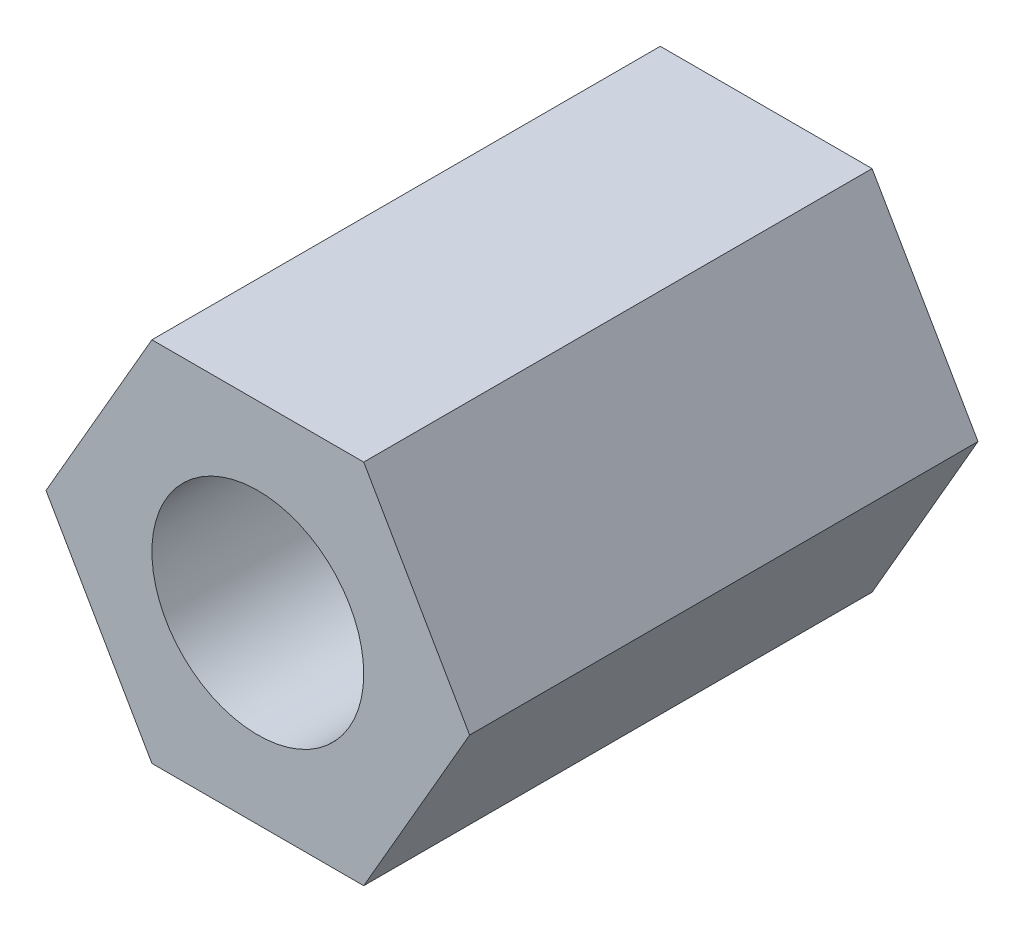
ISO-10303-21;
HEADER;
FILE_DESCRIPTION(('STEP AP214'),'2;1');
FILE_NAME('part.step','',(''),(''),'','','');
FILE_SCHEMA(('AUTOMOTIVE_DESIGN { 1 0 10303 214 1 1 1 1 }'));
ENDSEC;
DATA;
#1=APPLICATION_CONTEXT('core data for automotive mechanical design processes');
#2=APPLICATION_PROTOCOL_DEFINITION('international standard','automotive_design',2000,#1);
#3=PRODUCT_CONTEXT('',#1,'mechanical');
#4=PRODUCT('Part','Part','',(#3));
#5=PRODUCT_RELATED_PRODUCT_CATEGORY('part','',(#4));
#6=PRODUCT_DEFINITION_FORMATION('','',#4);
#7=PRODUCT_DEFINITION_CONTEXT('part definition',#1,'design');
#8=PRODUCT_DEFINITION('design','',#6,#7);
#9=PRODUCT_DEFINITION_SHAPE('','',#8);
#10=(LENGTH_UNIT() NAMED_UNIT(*) SI_UNIT(.MILLI.,.METRE.));
#11=(NAMED_UNIT(*) PLANE_ANGLE_UNIT() SI_UNIT($,.RADIAN.));
#12=(NAMED_UNIT(*) SI_UNIT($,.STERADIAN.) SOLID_ANGLE_UNIT());
#13=UNCERTAINTY_MEASURE_WITH_UNIT(LENGTH_MEASURE(1.E-05),#10,'distance_accuracy_value','');
#14=(GEOMETRIC_REPRESENTATION_CONTEXT(3) GLOBAL_UNCERTAINTY_ASSIGNED_CONTEXT((#13)) GLOBAL_UNIT_ASSIGNED_CONTEXT((#10,
#11,#12)) REPRESENTATION_CONTEXT('',''));
#15=CARTESIAN_POINT('',(0.,0.,0.));
#16=DIRECTION('',(0.,0.,1.));
#17=DIRECTION('',(1.,0.,0.));
#18=AXIS2_PLACEMENT_3D('',#15,#16,#17);
#19=CARTESIAN_POINT('',(-1.25,-2.1650635094611,6.));
#20=DIRECTION('',(0.866025403784439,-0.5,0.));
#21=DIRECTION('',(0.5,0.866025403784439,0.));
#22=AXIS2_PLACEMENT_3D('',#19,#20,#21);
#23=PLANE('',#22);
#24=DIRECTION('',(0.,0.,1.));
#25=VECTOR('',#24,1.);
#26=CARTESIAN_POINT('',(-1.25,-2.1650635094611,6.));
#27=LINE('',#26,#25);
#28=CARTESIAN_POINT('',(-1.25,-2.1650635094611,0.));
#29=VERTEX_POINT('',#28);
#30=CARTESIAN_POINT('',(-1.25,-2.1650635094611,6.));
#31=VERTEX_POINT('',#30);
#32=EDGE_CURVE('E96',#29,#31,#27,.T.);
#33=ORIENTED_EDGE('',*,*,#32,.T.);
#34=DIRECTION('',(0.5,0.866025403784439,0.));
#35=VECTOR('',#34,1.);
#36=CARTESIAN_POINT('',(-1.25,-2.1650635094611,6.));
#37=LINE('',#36,#35);
#38=CARTESIAN_POINT('',(0.,0.,6.));
#39=VERTEX_POINT('',#38);
#40=EDGE_CURVE('E108',#31,#39,#37,.T.);
#41=ORIENTED_EDGE('',*,*,#40,.T.);
#42=DIRECTION('',(0.,0.,-1.));
#43=VECTOR('',#42,1.);
#44=CARTESIAN_POINT('',(0.,0.,6.));
#45=LINE('',#44,#43);
#46=CARTESIAN_POINT('',(0.,0.,0.));
#47=VERTEX_POINT('',#46);
#48=EDGE_CURVE('E66',#39,#47,#45,.T.);
#49=ORIENTED_EDGE('',*,*,#48,.T.);
#50=DIRECTION('',(0.5,0.866025403784439,0.));
#51=VECTOR('',#50,1.);
#52=CARTESIAN_POINT('',(-1.25,-2.1650635094611,0.));
#53=LINE('',#52,#51);
#54=EDGE_CURVE('E107',#29,#47,#53,.T.);
#55=ORIENTED_EDGE('',*,*,#54,.F.);
#56=EDGE_LOOP('',(#33,#41,#49,#55));
#57=FACE_BOUND('',#56,.T.);
#58=ADVANCED_FACE('F17',(#57),#23,.F.);
#59=CARTESIAN_POINT('',(0.,0.,6.));
#60=DIRECTION('',(0.,-1.,0.));
#61=DIRECTION('',(0.,0.,-1.));
#62=AXIS2_PLACEMENT_3D('',#59,#60,#61);
#63=PLANE('',#62);
#64=ORIENTED_EDGE('',*,*,#48,.F.);
#65=DIRECTION('',(-1.,0.,0.));
#66=VECTOR('',#65,1.);
#67=CARTESIAN_POINT('',(0.,0.,6.));
#68=LINE('',#67,#66);
#69=CARTESIAN_POINT('',(2.5,0.,6.));
#70=VERTEX_POINT('',#69);
#71=EDGE_CURVE('E87',#39,#70,#68,.F.);
#72=ORIENTED_EDGE('',*,*,#71,.T.);
#73=DIRECTION('',(0.,0.,1.));
#74=VECTOR('',#73,1.);
#75=CARTESIAN_POINT('',(2.5,0.,6.));
#76=LINE('',#75,#74);
#77=CARTESIAN_POINT('',(2.5,0.,0.));
#78=VERTEX_POINT('',#77);
#79=EDGE_CURVE('E73',#70,#78,#76,.F.);
#80=ORIENTED_EDGE('',*,*,#79,.T.);
#81=DIRECTION('',(-1.,0.,0.));
#82=VECTOR('',#81,1.);
#83=CARTESIAN_POINT('',(0.,0.,0.));
#84=LINE('',#83,#82);
#85=EDGE_CURVE('E109',#47,#78,#84,.F.);
#86=ORIENTED_EDGE('',*,*,#85,.F.);
#87=EDGE_LOOP('',(#64,#72,#80,#86));
#88=FACE_BOUND('',#87,.T.);
#89=ADVANCED_FACE('F93',(#88),#63,.F.);
#90=CARTESIAN_POINT('',(2.5,0.,6.));
#91=DIRECTION('',(-0.866025403784439,-0.5,0.));
#92=DIRECTION('',(0.5,-0.866025403784439,0.));
#93=AXIS2_PLACEMENT_3D('',#90,#91,#92);
#94=PLANE('',#93);
#95=ORIENTED_EDGE('',*,*,#79,.F.);
#96=DIRECTION('',(0.5,-0.866025403784439,0.));
#97=VECTOR('',#96,1.);
#98=CARTESIAN_POINT('',(2.5,0.,6.));
#99=LINE('',#98,#97);
#100=CARTESIAN_POINT('',(3.75,-2.1650635094611,6.));
#101=VERTEX_POINT('',#100);
#102=EDGE_CURVE('E77',#70,#101,#99,.T.);
#103=ORIENTED_EDGE('',*,*,#102,.T.);
#104=DIRECTION('',(0.,0.,1.));
#105=VECTOR('',#104,1.);
#106=CARTESIAN_POINT('',(3.75,-2.1650635094611,6.));
#107=LINE('',#106,#105);
#108=CARTESIAN_POINT('',(3.75,-2.1650635094611,0.));
#109=VERTEX_POINT('',#108);
#110=EDGE_CURVE('E79',#101,#109,#107,.F.);
#111=ORIENTED_EDGE('',*,*,#110,.T.);
#112=DIRECTION('',(0.5,-0.866025403784439,0.));
#113=VECTOR('',#112,1.);
#114=CARTESIAN_POINT('',(2.5,0.,0.));
#115=LINE('',#114,#113);
#116=EDGE_CURVE('E78',#78,#109,#115,.T.);
#117=ORIENTED_EDGE('',*,*,#116,.F.);
#118=EDGE_LOOP('',(#95,#103,#111,#117));
#119=FACE_BOUND('',#118,.T.);
#120=ADVANCED_FACE('F75',(#119),#94,.F.);
#121=CARTESIAN_POINT('',(3.75,-2.1650635094611,6.));
#122=DIRECTION('',(-0.866025403784439,0.5,0.));
#123=DIRECTION('',(-0.5,-0.866025403784439,0.));
#124=AXIS2_PLACEMENT_3D('',#121,#122,#123);
#125=PLANE('',#124);
#126=ORIENTED_EDGE('',*,*,#110,.F.);
#127=DIRECTION('',(-0.5,-0.866025403784439,0.));
#128=VECTOR('',#127,1.);
#129=CARTESIAN_POINT('',(3.75,-2.1650635094611,6.));
#130=LINE('',#129,#128);
#131=CARTESIAN_POINT('',(2.5,-4.33012701892219,6.));
#132=VERTEX_POINT('',#131);
#133=EDGE_CURVE('E91',#101,#132,#130,.T.);
#134=ORIENTED_EDGE('',*,*,#133,.T.);
#135=DIRECTION('',(0.,0.,1.));
#136=VECTOR('',#135,1.);
#137=CARTESIAN_POINT('',(2.5,-4.33012701892219,6.));
#138=LINE('',#137,#136);
#139=CARTESIAN_POINT('',(2.5,-4.33012701892219,0.));
#140=VERTEX_POINT('',#139);
#141=EDGE_CURVE('E101',#132,#140,#138,.F.);
#142=ORIENTED_EDGE('',*,*,#141,.T.);
#143=DIRECTION('',(-0.5,-0.866025403784439,0.));
#144=VECTOR('',#143,1.);
#145=CARTESIAN_POINT('',(3.75,-2.1650635094611,0.));
#146=LINE('',#145,#144);
#147=EDGE_CURVE('E111',#109,#140,#146,.T.);
#148=ORIENTED_EDGE('',*,*,#147,.F.);
#149=EDGE_LOOP('',(#126,#134,#142,#148));
#150=FACE_BOUND('',#149,.T.);
#151=ADVANCED_FACE('F123',(#150),#125,.F.);
#152=CARTESIAN_POINT('',(2.5,-4.33012701892219,6.));
#153=DIRECTION('',(0.,1.,0.));
#154=DIRECTION('',(0.,0.,1.));
#155=AXIS2_PLACEMENT_3D('',#152,#153,#154);
#156=PLANE('',#155);
#157=ORIENTED_EDGE('',*,*,#141,.F.);
#158=DIRECTION('',(-1.,0.,0.));
#159=VECTOR('',#158,1.);
#160=CARTESIAN_POINT('',(0.,-4.33012701892219,6.));
#161=LINE('',#160,#159);
#162=CARTESIAN_POINT('',(0.,-4.33012701892219,6.));
#163=VERTEX_POINT('',#162);
#164=EDGE_CURVE('E120',#132,#163,#161,.T.);
#165=ORIENTED_EDGE('',*,*,#164,.T.);
#166=DIRECTION('',(0.,0.,1.));
#167=VECTOR('',#166,1.);
#168=CARTESIAN_POINT('',(0.,-4.33012701892219,6.));
#169=LINE('',#168,#167);
#170=CARTESIAN_POINT('',(0.,-4.33012701892219,0.));
#171=VERTEX_POINT('',#170);
#172=EDGE_CURVE('E94',#163,#171,#169,.F.);
#173=ORIENTED_EDGE('',*,*,#172,.T.);
#174=DIRECTION('',(-1.,0.,0.));
#175=VECTOR('',#174,1.);
#176=CARTESIAN_POINT('',(0.,-4.33012701892219,0.));
#177=LINE('',#176,#175);
#178=EDGE_CURVE('E33',#140,#171,#177,.T.);
#179=ORIENTED_EDGE('',*,*,#178,.F.);
#180=EDGE_LOOP('',(#157,#165,#173,#179));
#181=FACE_BOUND('',#180,.T.);
#182=ADVANCED_FACE('F150',(#181),#156,.F.);
#183=CARTESIAN_POINT('',(0.,-4.33012701892219,6.));
#184=DIRECTION('',(0.866025403784439,0.5,0.));
#185=DIRECTION('',(-0.5,0.866025403784439,0.));
#186=AXIS2_PLACEMENT_3D('',#183,#184,#185);
#187=PLANE('',#186);
#188=ORIENTED_EDGE('',*,*,#172,.F.);
#189=DIRECTION('',(-0.5,0.866025403784439,0.));
#190=VECTOR('',#189,1.);
#191=CARTESIAN_POINT('',(0.,-4.33012701892219,6.));
#192=LINE('',#191,#190);
#193=EDGE_CURVE('E117',#163,#31,#192,.T.);
#194=ORIENTED_EDGE('',*,*,#193,.T.);
#195=ORIENTED_EDGE('',*,*,#32,.F.);
#196=DIRECTION('',(-0.5,0.866025403784439,0.));
#197=VECTOR('',#196,1.);
#198=CARTESIAN_POINT('',(0.,-4.33012701892219,0.));
#199=LINE('',#198,#197);
#200=EDGE_CURVE('E125',#171,#29,#199,.T.);
#201=ORIENTED_EDGE('',*,*,#200,.F.);
#202=EDGE_LOOP('',(#188,#194,#195,#201));
#203=FACE_BOUND('',#202,.T.);
#204=ADVANCED_FACE('F145',(#203),#187,.F.);
#205=CARTESIAN_POINT('',(0.,0.,6.));
#206=DIRECTION('',(0.,0.,-1.));
#207=DIRECTION('',(-1.,0.,0.));
#208=AXIS2_PLACEMENT_3D('',#205,#206,#207);
#209=PLANE('',#208);
#210=ORIENTED_EDGE('',*,*,#193,.F.);
#211=ORIENTED_EDGE('',*,*,#164,.F.);
#212=ORIENTED_EDGE('',*,*,#133,.F.);
#213=ORIENTED_EDGE('',*,*,#102,.F.);
#214=ORIENTED_EDGE('',*,*,#71,.F.);
#215=ORIENTED_EDGE('',*,*,#40,.F.);
#216=EDGE_LOOP('',(#210,#211,#212,#213,#214,#215));
#217=FACE_BOUND('',#216,.T.);
#218=CARTESIAN_POINT('',(1.25,-2.1650635094611,6.));
#219=DIRECTION('',(0.,0.,1.));
#220=DIRECTION('',(1.,0.,0.));
#221=AXIS2_PLACEMENT_3D('',#218,#219,#220);
#222=CIRCLE('',#221,1.24999999999999);
#223=CARTESIAN_POINT('',(2.49999999999999,-2.1650635094611,6.));
#224=VERTEX_POINT('',#223);
#225=EDGE_CURVE('E20',#224,#224,#222,.F.);
#226=ORIENTED_EDGE('',*,*,#225,.T.);
#227=EDGE_LOOP('',(#226));
#228=FACE_BOUND('',#227,.T.);
#229=ADVANCED_FACE('F84',(#217,#228),#209,.F.);
#230=CARTESIAN_POINT('',(0.,0.,0.));
#231=DIRECTION('',(0.,0.,-1.));
#232=DIRECTION('',(-1.,0.,0.));
#233=AXIS2_PLACEMENT_3D('',#230,#231,#232);
#234=PLANE('',#233);
#235=ORIENTED_EDGE('',*,*,#178,.T.);
#236=ORIENTED_EDGE('',*,*,#200,.T.);
#237=ORIENTED_EDGE('',*,*,#54,.T.);
#238=ORIENTED_EDGE('',*,*,#85,.T.);
#239=ORIENTED_EDGE('',*,*,#116,.T.);
#240=ORIENTED_EDGE('',*,*,#147,.T.);
#241=EDGE_LOOP('',(#235,#236,#237,#238,#239,#240));
#242=FACE_BOUND('',#241,.T.);
#243=CARTESIAN_POINT('',(1.25,-2.1650635094611,0.));
#244=DIRECTION('',(0.,0.,1.));
#245=DIRECTION('',(1.,0.,0.));
#246=AXIS2_PLACEMENT_3D('',#243,#244,#245);
#247=CIRCLE('',#246,1.24999999999999);
#248=CARTESIAN_POINT('',(2.49999999999999,-2.1650635094611,0.));
#249=VERTEX_POINT('',#248);
#250=EDGE_CURVE('E11',#249,#249,#247,.T.);
#251=ORIENTED_EDGE('',*,*,#250,.T.);
#252=EDGE_LOOP('',(#251));
#253=FACE_BOUND('',#252,.T.);
#254=ADVANCED_FACE('F135',(#242,#253),#234,.T.);
#255=CARTESIAN_POINT('',(1.25,-2.1650635094611,6.));
#256=DIRECTION('',(0.,0.,1.));
#257=DIRECTION('',(1.,0.,0.));
#258=AXIS2_PLACEMENT_3D('',#255,#256,#257);
#259=CYLINDRICAL_SURFACE('',#258,1.24999999999999);
#260=ORIENTED_EDGE('',*,*,#225,.F.);
#261=EDGE_LOOP('',(#260));
#262=FACE_BOUND('',#261,.T.);
#263=ORIENTED_EDGE('',*,*,#250,.F.);
#264=EDGE_LOOP('',(#263));
#265=FACE_BOUND('',#264,.T.);
#266=ADVANCED_FACE('F132',(#262,#265),#259,.F.);
#267=CLOSED_SHELL('',(#58,#89,#120,#151,#182,#204,#229,#254,#266));
#268=MANIFOLD_SOLID_BREP('B1',#267);
#269=ADVANCED_BREP_SHAPE_REPRESENTATION('',(#18,#268),#14);
#270=SHAPE_DEFINITION_REPRESENTATION(#9,#269);
ENDSEC;
END-ISO-10303-21;
